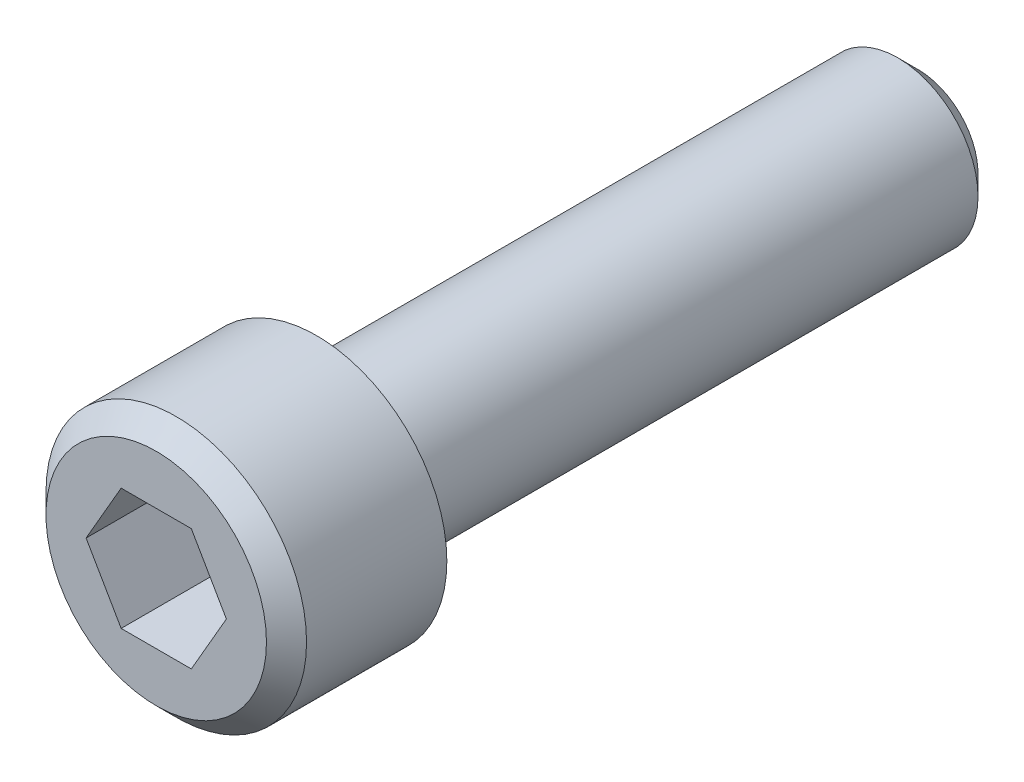
ISO-10303-21;
HEADER;
FILE_DESCRIPTION(('STEP AP214'),'2;1');
FILE_NAME('part.step','',(''),(''),'','','');
FILE_SCHEMA(('AUTOMOTIVE_DESIGN { 1 0 10303 214 1 1 1 1 }'));
ENDSEC;
DATA;
#1=APPLICATION_CONTEXT('core data for automotive mechanical design processes');
#2=APPLICATION_PROTOCOL_DEFINITION('international standard','automotive_design',2000,#1);
#3=PRODUCT_CONTEXT('',#1,'mechanical');
#4=PRODUCT('Part','Part','',(#3));
#5=PRODUCT_RELATED_PRODUCT_CATEGORY('part','',(#4));
#6=PRODUCT_DEFINITION_FORMATION('','',#4);
#7=PRODUCT_DEFINITION_CONTEXT('part definition',#1,'design');
#8=PRODUCT_DEFINITION('design','',#6,#7);
#9=PRODUCT_DEFINITION_SHAPE('','',#8);
#10=(LENGTH_UNIT() NAMED_UNIT(*) SI_UNIT(.MILLI.,.METRE.));
#11=(NAMED_UNIT(*) PLANE_ANGLE_UNIT() SI_UNIT($,.RADIAN.));
#12=(NAMED_UNIT(*) SI_UNIT($,.STERADIAN.) SOLID_ANGLE_UNIT());
#13=UNCERTAINTY_MEASURE_WITH_UNIT(LENGTH_MEASURE(1.E-05),#10,'distance_accuracy_value','');
#14=(GEOMETRIC_REPRESENTATION_CONTEXT(3) GLOBAL_UNCERTAINTY_ASSIGNED_CONTEXT((#13)) GLOBAL_UNIT_ASSIGNED_CONTEXT((#10,
#11,#12)) REPRESENTATION_CONTEXT('',''));
#15=CARTESIAN_POINT('',(0.,0.,0.));
#16=DIRECTION('',(0.,0.,1.));
#17=DIRECTION('',(1.,0.,0.));
#18=AXIS2_PLACEMENT_3D('',#15,#16,#17);
#19=CARTESIAN_POINT('',(0.,0.,0.));
#20=DIRECTION('',(0.,0.,1.));
#21=DIRECTION('',(1.,0.,0.));
#22=AXIS2_PLACEMENT_3D('',#19,#20,#21);
#23=PLANE('',#22);
#24=CARTESIAN_POINT('',(0.,0.,0.));
#25=DIRECTION('',(0.,0.,1.));
#26=DIRECTION('',(1.,0.,0.));
#27=AXIS2_PLACEMENT_3D('',#24,#25,#26);
#28=CIRCLE('',#27,6.5);
#29=CARTESIAN_POINT('',(6.5,0.,0.));
#30=VERTEX_POINT('',#29);
#31=EDGE_CURVE('E134',#30,#30,#28,.T.);
#32=ORIENTED_EDGE('',*,*,#31,.F.);
#33=EDGE_LOOP('',(#32));
#34=FACE_BOUND('',#33,.T.);
#35=CARTESIAN_POINT('',(0.,0.,0.));
#36=DIRECTION('',(0.,0.,1.));
#37=DIRECTION('',(1.,0.,0.));
#38=AXIS2_PLACEMENT_3D('',#35,#36,#37);
#39=CIRCLE('',#38,4.);
#40=CARTESIAN_POINT('',(4.,0.,0.));
#41=VERTEX_POINT('',#40);
#42=EDGE_CURVE('E142',#41,#41,#39,.F.);
#43=ORIENTED_EDGE('',*,*,#42,.F.);
#44=EDGE_LOOP('',(#43));
#45=FACE_BOUND('',#44,.T.);
#46=ADVANCED_FACE('F32',(#34,#45),#23,.F.);
#47=CARTESIAN_POINT('',(0.,0.,8.));
#48=DIRECTION('',(0.,0.,-1.));
#49=DIRECTION('',(-1.,0.,0.));
#50=AXIS2_PLACEMENT_3D('',#47,#48,#49);
#51=CYLINDRICAL_SURFACE('',#50,6.5);
#52=CARTESIAN_POINT('',(0.,0.,6.99999999999999));
#53=DIRECTION('',(0.,0.,1.));
#54=DIRECTION('',(1.,0.,0.));
#55=AXIS2_PLACEMENT_3D('',#52,#53,#54);
#56=CIRCLE('',#55,6.5);
#57=CARTESIAN_POINT('',(6.5,0.,6.99999999999999));
#58=VERTEX_POINT('',#57);
#59=EDGE_CURVE('E148',#58,#58,#56,.F.);
#60=ORIENTED_EDGE('',*,*,#59,.T.);
#61=EDGE_LOOP('',(#60));
#62=FACE_BOUND('',#61,.T.);
#63=ORIENTED_EDGE('',*,*,#31,.T.);
#64=EDGE_LOOP('',(#63));
#65=FACE_BOUND('',#64,.T.);
#66=ADVANCED_FACE('F168',(#62,#65),#51,.T.);
#67=CARTESIAN_POINT('',(0.,0.,8.));
#68=DIRECTION('',(0.,0.,1.));
#69=DIRECTION('',(1.,0.,0.));
#70=AXIS2_PLACEMENT_3D('',#67,#68,#69);
#71=PLANE('',#70);
#72=DIRECTION('',(0.5,0.866025403784439,0.));
#73=VECTOR('',#72,1.);
#74=CARTESIAN_POINT('',(1.75,-3.03108891324554,8.));
#75=LINE('',#74,#73);
#76=CARTESIAN_POINT('',(1.75,-3.03108891324554,8.));
#77=VERTEX_POINT('',#76);
#78=CARTESIAN_POINT('',(3.5,0.,8.));
#79=VERTEX_POINT('',#78);
#80=EDGE_CURVE('E47',#77,#79,#75,.T.);
#81=ORIENTED_EDGE('',*,*,#80,.F.);
#82=DIRECTION('',(1.,0.,0.));
#83=VECTOR('',#82,1.);
#84=CARTESIAN_POINT('',(-1.75,-3.03108891324554,8.));
#85=LINE('',#84,#83);
#86=CARTESIAN_POINT('',(-1.75,-3.03108891324554,8.));
#87=VERTEX_POINT('',#86);
#88=EDGE_CURVE('E130',#87,#77,#85,.T.);
#89=ORIENTED_EDGE('',*,*,#88,.F.);
#90=DIRECTION('',(0.5,-0.866025403784439,0.));
#91=VECTOR('',#90,1.);
#92=CARTESIAN_POINT('',(-3.5,0.,8.));
#93=LINE('',#92,#91);
#94=CARTESIAN_POINT('',(-3.5,0.,8.));
#95=VERTEX_POINT('',#94);
#96=EDGE_CURVE('E128',#95,#87,#93,.T.);
#97=ORIENTED_EDGE('',*,*,#96,.F.);
#98=DIRECTION('',(-0.5,-0.866025403784439,0.));
#99=VECTOR('',#98,1.);
#100=CARTESIAN_POINT('',(-1.75,3.03108891324554,8.));
#101=LINE('',#100,#99);
#102=CARTESIAN_POINT('',(-1.75,3.03108891324554,8.));
#103=VERTEX_POINT('',#102);
#104=EDGE_CURVE('E95',#103,#95,#101,.T.);
#105=ORIENTED_EDGE('',*,*,#104,.F.);
#106=DIRECTION('',(-1.,0.,0.));
#107=VECTOR('',#106,1.);
#108=CARTESIAN_POINT('',(1.75,3.03108891324554,8.));
#109=LINE('',#108,#107);
#110=CARTESIAN_POINT('',(1.75,3.03108891324554,8.));
#111=VERTEX_POINT('',#110);
#112=EDGE_CURVE('E124',#111,#103,#109,.T.);
#113=ORIENTED_EDGE('',*,*,#112,.F.);
#114=DIRECTION('',(-0.5,0.866025403784438,0.));
#115=VECTOR('',#114,1.);
#116=CARTESIAN_POINT('',(3.5,0.,8.));
#117=LINE('',#116,#115);
#118=EDGE_CURVE('E121',#79,#111,#117,.T.);
#119=ORIENTED_EDGE('',*,*,#118,.F.);
#120=EDGE_LOOP('',(#81,#89,#97,#105,#113,#119));
#121=FACE_BOUND('',#120,.T.);
#122=CARTESIAN_POINT('',(0.,0.,8.));
#123=DIRECTION('',(0.,0.,1.));
#124=DIRECTION('',(1.,0.,0.));
#125=AXIS2_PLACEMENT_3D('',#122,#123,#124);
#126=CIRCLE('',#125,5.5);
#127=CARTESIAN_POINT('',(5.5,0.,8.));
#128=VERTEX_POINT('',#127);
#129=EDGE_CURVE('E145',#128,#128,#126,.T.);
#130=ORIENTED_EDGE('',*,*,#129,.T.);
#131=EDGE_LOOP('',(#130));
#132=FACE_BOUND('',#131,.T.);
#133=ADVANCED_FACE('F174',(#121,#132),#71,.T.);
#134=CARTESIAN_POINT('',(0.,0.,-30.));
#135=DIRECTION('',(0.,0.,1.));
#136=DIRECTION('',(1.,0.,0.));
#137=AXIS2_PLACEMENT_3D('',#134,#135,#136);
#138=CYLINDRICAL_SURFACE('',#137,4.);
#139=CARTESIAN_POINT('',(0.,0.,-29.));
#140=DIRECTION('',(0.,0.,-1.));
#141=DIRECTION('',(-1.,0.,0.));
#142=AXIS2_PLACEMENT_3D('',#139,#140,#141);
#143=CIRCLE('',#142,4.);
#144=CARTESIAN_POINT('',(-4.,0.,-29.));
#145=VERTEX_POINT('',#144);
#146=EDGE_CURVE('E11',#145,#145,#143,.F.);
#147=ORIENTED_EDGE('',*,*,#146,.T.);
#148=EDGE_LOOP('',(#147));
#149=FACE_BOUND('',#148,.T.);
#150=ORIENTED_EDGE('',*,*,#42,.T.);
#151=EDGE_LOOP('',(#150));
#152=FACE_BOUND('',#151,.T.);
#153=ADVANCED_FACE('F182',(#149,#152),#138,.T.);
#154=CARTESIAN_POINT('',(0.,0.,-30.));
#155=DIRECTION('',(0.,0.,-1.));
#156=DIRECTION('',(-1.,0.,0.));
#157=AXIS2_PLACEMENT_3D('',#154,#155,#156);
#158=PLANE('',#157);
#159=CARTESIAN_POINT('',(0.,0.,-30.));
#160=DIRECTION('',(0.,0.,-1.));
#161=DIRECTION('',(-1.,0.,0.));
#162=AXIS2_PLACEMENT_3D('',#159,#160,#161);
#163=CIRCLE('',#162,2.99999999999999);
#164=CARTESIAN_POINT('',(-2.99999999999999,0.,-30.));
#165=VERTEX_POINT('',#164);
#166=EDGE_CURVE('E40',#165,#165,#163,.T.);
#167=ORIENTED_EDGE('',*,*,#166,.T.);
#168=EDGE_LOOP('',(#167));
#169=FACE_BOUND('',#168,.T.);
#170=ADVANCED_FACE('F153',(#169),#158,.T.);
#171=CARTESIAN_POINT('',(0.,0.,8.));
#172=DIRECTION('',(0.,0.,-1.));
#173=DIRECTION('',(-1.,0.,0.));
#174=AXIS2_PLACEMENT_3D('',#171,#172,#173);
#175=CONICAL_SURFACE('',#174,5.5,0.785398163397445);
#176=ORIENTED_EDGE('',*,*,#59,.F.);
#177=EDGE_LOOP('',(#176));
#178=FACE_BOUND('',#177,.T.);
#179=ORIENTED_EDGE('',*,*,#129,.F.);
#180=EDGE_LOOP('',(#179));
#181=FACE_BOUND('',#180,.T.);
#182=ADVANCED_FACE('F157',(#178,#181),#175,.T.);
#183=CARTESIAN_POINT('',(0.,0.,-30.));
#184=DIRECTION('',(0.,0.,1.));
#185=DIRECTION('',(1.,0.,0.));
#186=AXIS2_PLACEMENT_3D('',#183,#184,#185);
#187=CONICAL_SURFACE('',#186,2.99999999999999,0.785398163397447);
#188=ORIENTED_EDGE('',*,*,#146,.F.);
#189=EDGE_LOOP('',(#188));
#190=FACE_BOUND('',#189,.T.);
#191=ORIENTED_EDGE('',*,*,#166,.F.);
#192=EDGE_LOOP('',(#191));
#193=FACE_BOUND('',#192,.T.);
#194=ADVANCED_FACE('F34',(#190,#193),#187,.T.);
#195=CARTESIAN_POINT('',(1.75,-3.03108891324554,2.));
#196=DIRECTION('',(0.866025403784439,-0.5,0.));
#197=DIRECTION('',(0.5,0.866025403784439,0.));
#198=AXIS2_PLACEMENT_3D('',#195,#196,#197);
#199=PLANE('',#198);
#200=ORIENTED_EDGE('',*,*,#80,.T.);
#201=DIRECTION('',(0.,0.,1.));
#202=VECTOR('',#201,1.);
#203=CARTESIAN_POINT('',(3.5,0.,2.));
#204=LINE('',#203,#202);
#205=CARTESIAN_POINT('',(3.5,0.,2.));
#206=VERTEX_POINT('',#205);
#207=EDGE_CURVE('E77',#206,#79,#204,.T.);
#208=ORIENTED_EDGE('',*,*,#207,.F.);
#209=DIRECTION('',(0.5,0.866025403784439,0.));
#210=VECTOR('',#209,1.);
#211=CARTESIAN_POINT('',(1.75,-3.03108891324554,2.));
#212=LINE('',#211,#210);
#213=CARTESIAN_POINT('',(1.75,-3.03108891324554,2.));
#214=VERTEX_POINT('',#213);
#215=EDGE_CURVE('E132',#214,#206,#212,.T.);
#216=ORIENTED_EDGE('',*,*,#215,.F.);
#217=DIRECTION('',(0.,0.,1.));
#218=VECTOR('',#217,1.);
#219=CARTESIAN_POINT('',(1.75,-3.03108891324554,2.));
#220=LINE('',#219,#218);
#221=EDGE_CURVE('E55',#214,#77,#220,.T.);
#222=ORIENTED_EDGE('',*,*,#221,.T.);
#223=EDGE_LOOP('',(#200,#208,#216,#222));
#224=FACE_BOUND('',#223,.T.);
#225=ADVANCED_FACE('F156',(#224),#199,.F.);
#226=CARTESIAN_POINT('',(-1.75,-3.03108891324554,2.));
#227=DIRECTION('',(0.,-1.,0.));
#228=DIRECTION('',(0.,0.,-1.));
#229=AXIS2_PLACEMENT_3D('',#226,#227,#228);
#230=PLANE('',#229);
#231=ORIENTED_EDGE('',*,*,#88,.T.);
#232=ORIENTED_EDGE('',*,*,#221,.F.);
#233=DIRECTION('',(1.,0.,0.));
#234=VECTOR('',#233,1.);
#235=CARTESIAN_POINT('',(-1.75,-3.03108891324554,2.));
#236=LINE('',#235,#234);
#237=CARTESIAN_POINT('',(-1.75,-3.03108891324554,2.));
#238=VERTEX_POINT('',#237);
#239=EDGE_CURVE('E107',#238,#214,#236,.T.);
#240=ORIENTED_EDGE('',*,*,#239,.F.);
#241=DIRECTION('',(0.,0.,1.));
#242=VECTOR('',#241,1.);
#243=CARTESIAN_POINT('',(-1.75,-3.03108891324554,2.));
#244=LINE('',#243,#242);
#245=EDGE_CURVE('E99',#238,#87,#244,.T.);
#246=ORIENTED_EDGE('',*,*,#245,.T.);
#247=EDGE_LOOP('',(#231,#232,#240,#246));
#248=FACE_BOUND('',#247,.T.);
#249=ADVANCED_FACE('F163',(#248),#230,.F.);
#250=CARTESIAN_POINT('',(-3.5,0.,2.));
#251=DIRECTION('',(-0.866025403784439,-0.5,0.));
#252=DIRECTION('',(0.5,-0.866025403784439,0.));
#253=AXIS2_PLACEMENT_3D('',#250,#251,#252);
#254=PLANE('',#253);
#255=ORIENTED_EDGE('',*,*,#96,.T.);
#256=ORIENTED_EDGE('',*,*,#245,.F.);
#257=DIRECTION('',(0.5,-0.866025403784439,0.));
#258=VECTOR('',#257,1.);
#259=CARTESIAN_POINT('',(-3.5,0.,2.));
#260=LINE('',#259,#258);
#261=CARTESIAN_POINT('',(-3.5,0.,2.));
#262=VERTEX_POINT('',#261);
#263=EDGE_CURVE('E103',#262,#238,#260,.T.);
#264=ORIENTED_EDGE('',*,*,#263,.F.);
#265=DIRECTION('',(0.,0.,1.));
#266=VECTOR('',#265,1.);
#267=CARTESIAN_POINT('',(-3.5,0.,2.));
#268=LINE('',#267,#266);
#269=EDGE_CURVE('E88',#262,#95,#268,.T.);
#270=ORIENTED_EDGE('',*,*,#269,.T.);
#271=EDGE_LOOP('',(#255,#256,#264,#270));
#272=FACE_BOUND('',#271,.T.);
#273=ADVANCED_FACE('F104',(#272),#254,.F.);
#274=CARTESIAN_POINT('',(-1.75,3.03108891324554,2.));
#275=DIRECTION('',(-0.866025403784439,0.5,0.));
#276=DIRECTION('',(-0.5,-0.866025403784439,0.));
#277=AXIS2_PLACEMENT_3D('',#274,#275,#276);
#278=PLANE('',#277);
#279=ORIENTED_EDGE('',*,*,#104,.T.);
#280=ORIENTED_EDGE('',*,*,#269,.F.);
#281=DIRECTION('',(-0.5,-0.866025403784439,0.));
#282=VECTOR('',#281,1.);
#283=CARTESIAN_POINT('',(-1.75,3.03108891324554,2.));
#284=LINE('',#283,#282);
#285=CARTESIAN_POINT('',(-1.75,3.03108891324554,2.));
#286=VERTEX_POINT('',#285);
#287=EDGE_CURVE('E92',#286,#262,#284,.T.);
#288=ORIENTED_EDGE('',*,*,#287,.F.);
#289=DIRECTION('',(0.,0.,1.));
#290=VECTOR('',#289,1.);
#291=CARTESIAN_POINT('',(-1.75,3.03108891324554,2.));
#292=LINE('',#291,#290);
#293=EDGE_CURVE('E100',#286,#103,#292,.T.);
#294=ORIENTED_EDGE('',*,*,#293,.T.);
#295=EDGE_LOOP('',(#279,#280,#288,#294));
#296=FACE_BOUND('',#295,.T.);
#297=ADVANCED_FACE('F90',(#296),#278,.F.);
#298=CARTESIAN_POINT('',(1.75,3.03108891324554,2.));
#299=DIRECTION('',(0.,1.,0.));
#300=DIRECTION('',(0.,0.,1.));
#301=AXIS2_PLACEMENT_3D('',#298,#299,#300);
#302=PLANE('',#301);
#303=ORIENTED_EDGE('',*,*,#112,.T.);
#304=ORIENTED_EDGE('',*,*,#293,.F.);
#305=DIRECTION('',(-1.,0.,0.));
#306=VECTOR('',#305,1.);
#307=CARTESIAN_POINT('',(1.75,3.03108891324554,2.));
#308=LINE('',#307,#306);
#309=CARTESIAN_POINT('',(1.75,3.03108891324554,2.));
#310=VERTEX_POINT('',#309);
#311=EDGE_CURVE('E113',#310,#286,#308,.T.);
#312=ORIENTED_EDGE('',*,*,#311,.F.);
#313=DIRECTION('',(0.,0.,1.));
#314=VECTOR('',#313,1.);
#315=CARTESIAN_POINT('',(1.75,3.03108891324554,2.));
#316=LINE('',#315,#314);
#317=EDGE_CURVE('E137',#310,#111,#316,.T.);
#318=ORIENTED_EDGE('',*,*,#317,.T.);
#319=EDGE_LOOP('',(#303,#304,#312,#318));
#320=FACE_BOUND('',#319,.T.);
#321=ADVANCED_FACE('F192',(#320),#302,.F.);
#322=CARTESIAN_POINT('',(3.5,0.,2.));
#323=DIRECTION('',(0.866025403784438,0.5,0.));
#324=DIRECTION('',(-0.5,0.866025403784439,0.));
#325=AXIS2_PLACEMENT_3D('',#322,#323,#324);
#326=PLANE('',#325);
#327=ORIENTED_EDGE('',*,*,#118,.T.);
#328=ORIENTED_EDGE('',*,*,#317,.F.);
#329=DIRECTION('',(-0.5,0.866025403784438,0.));
#330=VECTOR('',#329,1.);
#331=CARTESIAN_POINT('',(3.5,0.,2.));
#332=LINE('',#331,#330);
#333=EDGE_CURVE('E115',#206,#310,#332,.T.);
#334=ORIENTED_EDGE('',*,*,#333,.F.);
#335=ORIENTED_EDGE('',*,*,#207,.T.);
#336=EDGE_LOOP('',(#327,#328,#334,#335));
#337=FACE_BOUND('',#336,.T.);
#338=ADVANCED_FACE('F189',(#337),#326,.F.);
#339=CARTESIAN_POINT('',(0.,0.,2.));
#340=DIRECTION('',(0.,0.,1.));
#341=DIRECTION('',(1.,0.,0.));
#342=AXIS2_PLACEMENT_3D('',#339,#340,#341);
#343=PLANE('',#342);
#344=ORIENTED_EDGE('',*,*,#215,.T.);
#345=ORIENTED_EDGE('',*,*,#333,.T.);
#346=ORIENTED_EDGE('',*,*,#311,.T.);
#347=ORIENTED_EDGE('',*,*,#287,.T.);
#348=ORIENTED_EDGE('',*,*,#263,.T.);
#349=ORIENTED_EDGE('',*,*,#239,.T.);
#350=EDGE_LOOP('',(#344,#345,#346,#347,#348,#349));
#351=FACE_BOUND('',#350,.T.);
#352=ADVANCED_FACE('F110',(#351),#343,.T.);
#353=CLOSED_SHELL('',(#46,#66,#133,#153,#170,#182,#194,#225,#249,#273,#297,#321,#338,#352));
#354=MANIFOLD_SOLID_BREP('B2',#353);
#355=ADVANCED_BREP_SHAPE_REPRESENTATION('',(#18,#354),#14);
#356=SHAPE_DEFINITION_REPRESENTATION(#9,#355);
ENDSEC;
END-ISO-10303-21;
